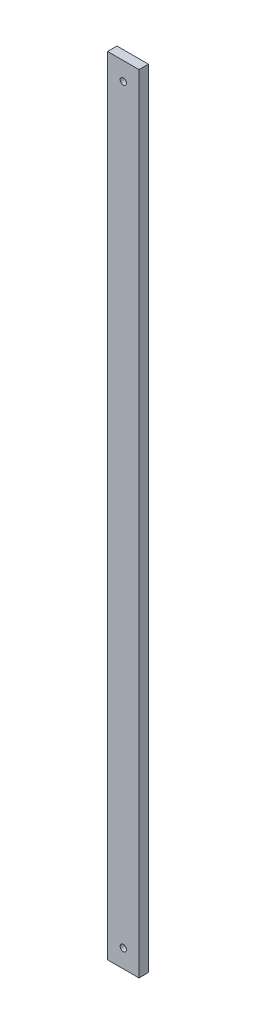
ISO-10303-21;
HEADER;
FILE_DESCRIPTION(('STEP AP214'),'2;1');
FILE_NAME('part.step','',(''),(''),'','','');
FILE_SCHEMA(('AUTOMOTIVE_DESIGN { 1 0 10303 214 1 1 1 1 }'));
ENDSEC;
DATA;
#1=APPLICATION_CONTEXT('core data for automotive mechanical design processes');
#2=APPLICATION_PROTOCOL_DEFINITION('international standard','automotive_design',2000,#1);
#3=PRODUCT_CONTEXT('',#1,'mechanical');
#4=PRODUCT('Part','Part','',(#3));
#5=PRODUCT_RELATED_PRODUCT_CATEGORY('part','',(#4));
#6=PRODUCT_DEFINITION_FORMATION('','',#4);
#7=PRODUCT_DEFINITION_CONTEXT('part definition',#1,'design');
#8=PRODUCT_DEFINITION('design','',#6,#7);
#9=PRODUCT_DEFINITION_SHAPE('','',#8);
#10=(LENGTH_UNIT() NAMED_UNIT(*) SI_UNIT(.MILLI.,.METRE.));
#11=(NAMED_UNIT(*) PLANE_ANGLE_UNIT() SI_UNIT($,.RADIAN.));
#12=(NAMED_UNIT(*) SI_UNIT($,.STERADIAN.) SOLID_ANGLE_UNIT());
#13=UNCERTAINTY_MEASURE_WITH_UNIT(LENGTH_MEASURE(1.E-05),#10,'distance_accuracy_value','');
#14=(GEOMETRIC_REPRESENTATION_CONTEXT(3) GLOBAL_UNCERTAINTY_ASSIGNED_CONTEXT((#13)) GLOBAL_UNIT_ASSIGNED_CONTEXT((#10,
#11,#12)) REPRESENTATION_CONTEXT('',''));
#15=CARTESIAN_POINT('',(0.,0.,0.));
#16=DIRECTION('',(0.,0.,1.));
#17=DIRECTION('',(1.,0.,0.));
#18=AXIS2_PLACEMENT_3D('',#15,#16,#17);
#19=CARTESIAN_POINT('',(-1.27675647831893E-12,500.000000000004,0.));
#20=DIRECTION('',(1.00000000000001,0.,0.));
#21=DIRECTION('',(0.,0.,-1.));
#22=AXIS2_PLACEMENT_3D('',#19,#20,#21);
#23=PLANE('',#22);
#24=DIRECTION('',(0.,0.,1.));
#25=VECTOR('',#24,1.);
#26=CARTESIAN_POINT('',(0.,0.,0.));
#27=LINE('',#26,#25);
#28=CARTESIAN_POINT('',(0.,3.33066907387547E-13,-6.000000000003));
#29=VERTEX_POINT('',#28);
#30=CARTESIAN_POINT('',(0.,0.,0.));
#31=VERTEX_POINT('',#30);
#32=EDGE_CURVE('E111',#29,#31,#27,.T.);
#33=ORIENTED_EDGE('',*,*,#32,.T.);
#34=DIRECTION('',(0.,-1.00000000000001,0.));
#35=VECTOR('',#34,1.);
#36=CARTESIAN_POINT('',(-1.27675647831893E-12,500.000000000004,0.));
#37=LINE('',#36,#35);
#38=CARTESIAN_POINT('',(-1.27675647831893E-12,500.000000000004,0.));
#39=VERTEX_POINT('',#38);
#40=EDGE_CURVE('E11',#39,#31,#37,.T.);
#41=ORIENTED_EDGE('',*,*,#40,.F.);
#42=DIRECTION('',(0.,0.,1.));
#43=VECTOR('',#42,1.);
#44=CARTESIAN_POINT('',(-1.27675647831893E-12,500.000000000004,0.));
#45=LINE('',#44,#43);
#46=CARTESIAN_POINT('',(-6.10622663543836E-13,500.000000000004,-6.00000000000278));
#47=VERTEX_POINT('',#46);
#48=EDGE_CURVE('E94',#47,#39,#45,.T.);
#49=ORIENTED_EDGE('',*,*,#48,.F.);
#50=DIRECTION('',(0.,-1.00000000000001,0.));
#51=VECTOR('',#50,1.);
#52=CARTESIAN_POINT('',(-6.10622663543836E-13,500.000000000004,-6.00000000000278));
#53=LINE('',#52,#51);
#54=EDGE_CURVE('E107',#47,#29,#53,.T.);
#55=ORIENTED_EDGE('',*,*,#54,.T.);
#56=EDGE_LOOP('',(#33,#41,#49,#55));
#57=FACE_BOUND('',#56,.T.);
#58=ADVANCED_FACE('F42',(#57),#23,.F.);
#59=CARTESIAN_POINT('',(-1.27675647831893E-12,500.000000000004,0.));
#60=DIRECTION('',(0.,0.,-1.));
#61=DIRECTION('',(-1.00000000000001,0.,0.));
#62=AXIS2_PLACEMENT_3D('',#59,#60,#61);
#63=PLANE('',#62);
#64=CARTESIAN_POINT('',(10.,488.500000000004,-2.03136119036884E-12));
#65=DIRECTION('',(0.,0.,-1.));
#66=DIRECTION('',(-1.00000000000001,0.,0.));
#67=AXIS2_PLACEMENT_3D('',#64,#65,#66);
#68=CIRCLE('',#67,2.);
#69=CARTESIAN_POINT('',(7.99999999999999,488.500000000004,-2.03136119036884E-12));
#70=VERTEX_POINT('',#69);
#71=EDGE_CURVE('E115',#70,#70,#68,.T.);
#72=ORIENTED_EDGE('',*,*,#71,.T.);
#73=EDGE_LOOP('',(#72));
#74=FACE_BOUND('',#73,.T.);
#75=CARTESIAN_POINT('',(10.,11.4999999999995,-2.1094237467878E-12));
#76=DIRECTION('',(0.,0.,-1.));
#77=DIRECTION('',(-1.00000000000001,0.,0.));
#78=AXIS2_PLACEMENT_3D('',#75,#76,#77);
#79=CIRCLE('',#78,2.);
#80=CARTESIAN_POINT('',(7.99999999999999,11.4999999999995,-2.1094237467878E-12));
#81=VERTEX_POINT('',#80);
#82=EDGE_CURVE('E137',#81,#81,#79,.T.);
#83=ORIENTED_EDGE('',*,*,#82,.T.);
#84=EDGE_LOOP('',(#83));
#85=FACE_BOUND('',#84,.T.);
#86=DIRECTION('',(1.00000000000001,0.,0.));
#87=VECTOR('',#86,1.);
#88=CARTESIAN_POINT('',(0.,0.,0.));
#89=LINE('',#88,#87);
#90=CARTESIAN_POINT('',(20.,-4.9960036108132E-13,0.));
#91=VERTEX_POINT('',#90);
#92=EDGE_CURVE('E99',#31,#91,#89,.T.);
#93=ORIENTED_EDGE('',*,*,#92,.T.);
#94=DIRECTION('',(0.,-1.00000000000001,0.));
#95=VECTOR('',#94,1.);
#96=CARTESIAN_POINT('',(20.,500.000000000004,0.));
#97=LINE('',#96,#95);
#98=CARTESIAN_POINT('',(20.,500.000000000004,0.));
#99=VERTEX_POINT('',#98);
#100=EDGE_CURVE('E51',#99,#91,#97,.T.);
#101=ORIENTED_EDGE('',*,*,#100,.F.);
#102=DIRECTION('',(1.00000000000001,0.,0.));
#103=VECTOR('',#102,1.);
#104=CARTESIAN_POINT('',(-1.27675647831893E-12,500.000000000004,0.));
#105=LINE('',#104,#103);
#106=EDGE_CURVE('E89',#39,#99,#105,.T.);
#107=ORIENTED_EDGE('',*,*,#106,.F.);
#108=ORIENTED_EDGE('',*,*,#40,.T.);
#109=EDGE_LOOP('',(#93,#101,#107,#108));
#110=FACE_BOUND('',#109,.T.);
#111=ADVANCED_FACE('F98',(#74,#85,#110),#63,.F.);
#112=CARTESIAN_POINT('',(20.,500.000000000004,0.));
#113=DIRECTION('',(-1.00000000000001,0.,0.));
#114=DIRECTION('',(0.,0.,1.));
#115=AXIS2_PLACEMENT_3D('',#112,#113,#114);
#116=PLANE('',#115);
#117=DIRECTION('',(0.,0.,-1.));
#118=VECTOR('',#117,1.);
#119=CARTESIAN_POINT('',(20.,-4.9960036108132E-13,0.));
#120=LINE('',#119,#118);
#121=CARTESIAN_POINT('',(20.,-4.9960036108132E-13,-6.00000000000345));
#122=VERTEX_POINT('',#121);
#123=EDGE_CURVE('E76',#91,#122,#120,.T.);
#124=ORIENTED_EDGE('',*,*,#123,.T.);
#125=DIRECTION('',(0.,-1.00000000000001,0.));
#126=VECTOR('',#125,1.);
#127=CARTESIAN_POINT('',(20.,500.000000000004,-6.00000000000278));
#128=LINE('',#127,#126);
#129=CARTESIAN_POINT('',(20.,500.000000000004,-6.00000000000278));
#130=VERTEX_POINT('',#129);
#131=EDGE_CURVE('E101',#130,#122,#128,.T.);
#132=ORIENTED_EDGE('',*,*,#131,.F.);
#133=DIRECTION('',(0.,0.,-1.));
#134=VECTOR('',#133,1.);
#135=CARTESIAN_POINT('',(20.,500.000000000004,0.));
#136=LINE('',#135,#134);
#137=EDGE_CURVE('E92',#99,#130,#136,.T.);
#138=ORIENTED_EDGE('',*,*,#137,.F.);
#139=ORIENTED_EDGE('',*,*,#100,.T.);
#140=EDGE_LOOP('',(#124,#132,#138,#139));
#141=FACE_BOUND('',#140,.T.);
#142=ADVANCED_FACE('F102',(#141),#116,.F.);
#143=CARTESIAN_POINT('',(-6.10622663543836E-13,500.000000000004,-6.00000000000278));
#144=DIRECTION('',(0.,0.,1.));
#145=DIRECTION('',(1.00000000000001,0.,0.));
#146=AXIS2_PLACEMENT_3D('',#143,#144,#145);
#147=PLANE('',#146);
#148=CARTESIAN_POINT('',(9.99999999999995,488.500000000004,-6.00000000000278));
#149=DIRECTION('',(0.,0.,-1.));
#150=DIRECTION('',(-1.00000000000001,0.,0.));
#151=AXIS2_PLACEMENT_3D('',#148,#149,#150);
#152=CIRCLE('',#151,2.);
#153=CARTESIAN_POINT('',(7.99999999999994,488.500000000004,-6.00000000000278));
#154=VERTEX_POINT('',#153);
#155=EDGE_CURVE('E141',#154,#154,#152,.T.);
#156=ORIENTED_EDGE('',*,*,#155,.F.);
#157=EDGE_LOOP('',(#156));
#158=FACE_BOUND('',#157,.T.);
#159=CARTESIAN_POINT('',(10.,11.4999999999995,-6.000000000003));
#160=DIRECTION('',(0.,0.,-1.));
#161=DIRECTION('',(-1.00000000000001,0.,0.));
#162=AXIS2_PLACEMENT_3D('',#159,#160,#161);
#163=CIRCLE('',#162,2.);
#164=CARTESIAN_POINT('',(7.99999999999999,11.4999999999995,-6.000000000003));
#165=VERTEX_POINT('',#164);
#166=EDGE_CURVE('E142',#165,#165,#163,.T.);
#167=ORIENTED_EDGE('',*,*,#166,.F.);
#168=EDGE_LOOP('',(#167));
#169=FACE_BOUND('',#168,.T.);
#170=DIRECTION('',(-1.00000000000001,0.,0.));
#171=VECTOR('',#170,1.);
#172=CARTESIAN_POINT('',(0.,3.33066907387547E-13,-6.000000000003));
#173=LINE('',#172,#171);
#174=EDGE_CURVE('E82',#122,#29,#173,.T.);
#175=ORIENTED_EDGE('',*,*,#174,.T.);
#176=ORIENTED_EDGE('',*,*,#54,.F.);
#177=DIRECTION('',(-1.00000000000001,0.,0.));
#178=VECTOR('',#177,1.);
#179=CARTESIAN_POINT('',(-6.10622663543836E-13,500.000000000004,-6.00000000000278));
#180=LINE('',#179,#178);
#181=EDGE_CURVE('E59',#130,#47,#180,.T.);
#182=ORIENTED_EDGE('',*,*,#181,.F.);
#183=ORIENTED_EDGE('',*,*,#131,.T.);
#184=EDGE_LOOP('',(#175,#176,#182,#183));
#185=FACE_BOUND('',#184,.T.);
#186=ADVANCED_FACE('F126',(#158,#169,#185),#147,.F.);
#187=CARTESIAN_POINT('',(-1.27675647831893E-12,500.000000000004,0.));
#188=DIRECTION('',(0.,-1.00000000000001,0.));
#189=DIRECTION('',(0.,0.,-1.));
#190=AXIS2_PLACEMENT_3D('',#187,#188,#189);
#191=PLANE('',#190);
#192=ORIENTED_EDGE('',*,*,#48,.T.);
#193=ORIENTED_EDGE('',*,*,#106,.T.);
#194=ORIENTED_EDGE('',*,*,#137,.T.);
#195=ORIENTED_EDGE('',*,*,#181,.T.);
#196=EDGE_LOOP('',(#192,#193,#194,#195));
#197=FACE_BOUND('',#196,.T.);
#198=ADVANCED_FACE('F90',(#197),#191,.F.);
#199=CARTESIAN_POINT('',(0.,0.,0.));
#200=DIRECTION('',(0.,-1.00000000000001,0.));
#201=DIRECTION('',(0.,0.,-1.));
#202=AXIS2_PLACEMENT_3D('',#199,#200,#201);
#203=PLANE('',#202);
#204=ORIENTED_EDGE('',*,*,#32,.F.);
#205=ORIENTED_EDGE('',*,*,#174,.F.);
#206=ORIENTED_EDGE('',*,*,#123,.F.);
#207=ORIENTED_EDGE('',*,*,#92,.F.);
#208=EDGE_LOOP('',(#204,#205,#206,#207));
#209=FACE_BOUND('',#208,.T.);
#210=ADVANCED_FACE('F129',(#209),#203,.T.);
#211=CARTESIAN_POINT('',(9.99999999999995,11.4999999999995,4.));
#212=DIRECTION('',(0.,0.,-1.));
#213=DIRECTION('',(-1.00000000000001,0.,0.));
#214=AXIS2_PLACEMENT_3D('',#211,#212,#213);
#215=CYLINDRICAL_SURFACE('',#214,2.);
#216=ORIENTED_EDGE('',*,*,#166,.T.);
#217=EDGE_LOOP('',(#216));
#218=FACE_BOUND('',#217,.T.);
#219=ORIENTED_EDGE('',*,*,#82,.F.);
#220=EDGE_LOOP('',(#219));
#221=FACE_BOUND('',#220,.T.);
#222=ADVANCED_FACE('F159',(#218,#221),#215,.F.);
#223=CARTESIAN_POINT('',(9.99999999999995,488.500000000004,4.));
#224=DIRECTION('',(0.,0.,-1.));
#225=DIRECTION('',(-1.00000000000001,0.,0.));
#226=AXIS2_PLACEMENT_3D('',#223,#224,#225);
#227=CYLINDRICAL_SURFACE('',#226,2.);
#228=ORIENTED_EDGE('',*,*,#155,.T.);
#229=EDGE_LOOP('',(#228));
#230=FACE_BOUND('',#229,.T.);
#231=ORIENTED_EDGE('',*,*,#71,.F.);
#232=EDGE_LOOP('',(#231));
#233=FACE_BOUND('',#232,.T.);
#234=ADVANCED_FACE('F151',(#230,#233),#227,.F.);
#235=CLOSED_SHELL('',(#58,#111,#142,#186,#198,#210,#222,#234));
#236=MANIFOLD_SOLID_BREP('B2',#235);
#237=ADVANCED_BREP_SHAPE_REPRESENTATION('',(#18,#236),#14);
#238=SHAPE_DEFINITION_REPRESENTATION(#9,#237);
ENDSEC;
END-ISO-10303-21;
